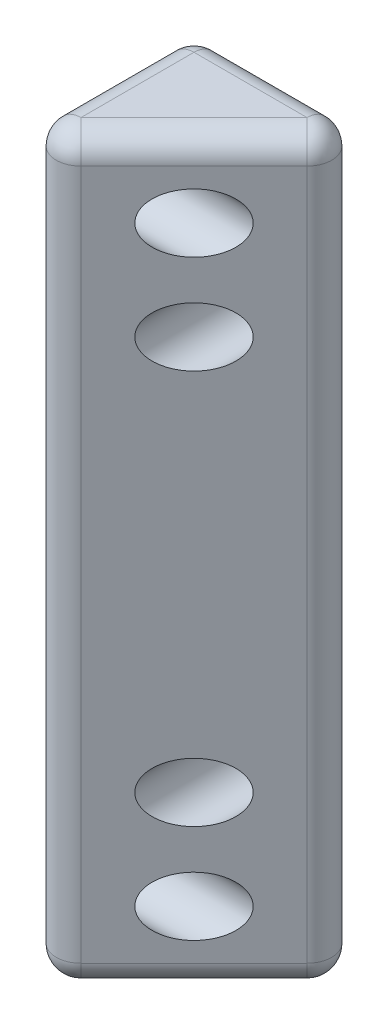
ISO-10303-21;
HEADER;
FILE_DESCRIPTION(('STEP AP214'),'2;1');
FILE_NAME('part.step','',(''),(''),'','','');
FILE_SCHEMA(('AUTOMOTIVE_DESIGN { 1 0 10303 214 1 1 1 1 }'));
ENDSEC;
DATA;
#1=APPLICATION_CONTEXT('core data for automotive mechanical design processes');
#2=APPLICATION_PROTOCOL_DEFINITION('international standard','automotive_design',2000,#1);
#3=PRODUCT_CONTEXT('',#1,'mechanical');
#4=PRODUCT('Part','Part','',(#3));
#5=PRODUCT_RELATED_PRODUCT_CATEGORY('part','',(#4));
#6=PRODUCT_DEFINITION_FORMATION('','',#4);
#7=PRODUCT_DEFINITION_CONTEXT('part definition',#1,'design');
#8=PRODUCT_DEFINITION('design','',#6,#7);
#9=PRODUCT_DEFINITION_SHAPE('','',#8);
#10=(LENGTH_UNIT() NAMED_UNIT(*) SI_UNIT(.MILLI.,.METRE.));
#11=(NAMED_UNIT(*) PLANE_ANGLE_UNIT() SI_UNIT($,.RADIAN.));
#12=(NAMED_UNIT(*) SI_UNIT($,.STERADIAN.) SOLID_ANGLE_UNIT());
#13=UNCERTAINTY_MEASURE_WITH_UNIT(LENGTH_MEASURE(1.E-05),#10,'distance_accuracy_value','');
#14=(GEOMETRIC_REPRESENTATION_CONTEXT(3) GLOBAL_UNCERTAINTY_ASSIGNED_CONTEXT((#13)) GLOBAL_UNIT_ASSIGNED_CONTEXT((#10,
#11,#12)) REPRESENTATION_CONTEXT('',''));
#15=CARTESIAN_POINT('',(0.,0.,0.));
#16=DIRECTION('',(0.,0.,1.));
#17=DIRECTION('',(1.,0.,0.));
#18=AXIS2_PLACEMENT_3D('',#15,#16,#17);
#19=CARTESIAN_POINT('',(-12.7,23.8125,12.7));
#20=DIRECTION('',(-0.707106781186548,0.,-0.707106781186547));
#21=DIRECTION('',(-0.707106781186547,0.,0.707106781186548));
#22=AXIS2_PLACEMENT_3D('',#19,#20,#21);
#23=PLANE('',#22);
#24=DIRECTION('',(0.707106781186547,0.,-0.707106781186548));
#25=VECTOR('',#24,1.);
#26=CARTESIAN_POINT('',(-12.7,-22.225,12.7));
#27=LINE('',#26,#25);
#28=CARTESIAN_POINT('',(-9.98996798486635,-22.225,9.98996798486636));
#29=VERTEX_POINT('',#28);
#30=CARTESIAN_POINT('',(-2.71003201513364,-22.225,2.71003201513364));
#31=VERTEX_POINT('',#30);
#32=EDGE_CURVE('E192',#29,#31,#27,.T.);
#33=ORIENTED_EDGE('',*,*,#32,.T.);
#34=DIRECTION('',(0.,-1.,0.));
#35=VECTOR('',#34,1.);
#36=CARTESIAN_POINT('',(-2.71003201513364,23.8125,2.71003201513364));
#37=LINE('',#36,#35);
#38=CARTESIAN_POINT('',(-2.71003201513364,22.225,2.71003201513364));
#39=VERTEX_POINT('',#38);
#40=EDGE_CURVE('E196',#31,#39,#37,.F.);
#41=ORIENTED_EDGE('',*,*,#40,.T.);
#42=DIRECTION('',(0.707106781186547,0.,-0.707106781186548));
#43=VECTOR('',#42,1.);
#44=CARTESIAN_POINT('',(-12.7,22.225,12.7));
#45=LINE('',#44,#43);
#46=CARTESIAN_POINT('',(-9.98996798486635,22.225,9.98996798486636));
#47=VERTEX_POINT('',#46);
#48=EDGE_CURVE('E189',#39,#47,#45,.F.);
#49=ORIENTED_EDGE('',*,*,#48,.T.);
#50=DIRECTION('',(0.,-1.,0.));
#51=VECTOR('',#50,1.);
#52=CARTESIAN_POINT('',(-9.98996798486635,23.8125,9.98996798486636));
#53=LINE('',#52,#51);
#54=EDGE_CURVE('E186',#47,#29,#53,.T.);
#55=ORIENTED_EDGE('',*,*,#54,.T.);
#56=EDGE_LOOP('',(#33,#41,#49,#55));
#57=FACE_BOUND('',#56,.T.);
#58=CARTESIAN_POINT('',(-6.35,-12.7,6.35000000000001));
#59=DIRECTION('',(-0.707106781186548,0.,-0.707106781186547));
#60=DIRECTION('',(0.707106781186547,0.,-0.707106781186548));
#61=AXIS2_PLACEMENT_3D('',#58,#59,#60);
#62=ELLIPSE('',#61,2.69407683632075,1.905);
#63=CARTESIAN_POINT('',(-4.445,-12.7,4.44500000000001));
#64=VERTEX_POINT('',#63);
#65=EDGE_CURVE('E276',#64,#64,#62,.T.);
#66=ORIENTED_EDGE('',*,*,#65,.T.);
#67=EDGE_LOOP('',(#66));
#68=FACE_BOUND('',#67,.T.);
#69=CARTESIAN_POINT('',(-6.35,12.7,6.35000000000001));
#70=DIRECTION('',(-0.707106781186548,0.,-0.707106781186547));
#71=DIRECTION('',(0.707106781186547,0.,-0.707106781186548));
#72=AXIS2_PLACEMENT_3D('',#69,#70,#71);
#73=ELLIPSE('',#72,2.69407683632075,1.905);
#74=CARTESIAN_POINT('',(-4.445,12.7,4.44500000000001));
#75=VERTEX_POINT('',#74);
#76=EDGE_CURVE('E270',#75,#75,#73,.T.);
#77=ORIENTED_EDGE('',*,*,#76,.T.);
#78=EDGE_LOOP('',(#77));
#79=FACE_BOUND('',#78,.T.);
#80=CARTESIAN_POINT('',(-6.35,19.05,6.35));
#81=DIRECTION('',(-0.707106781186548,0.,-0.707106781186547));
#82=DIRECTION('',(-0.707106781186547,0.,0.707106781186548));
#83=AXIS2_PLACEMENT_3D('',#80,#81,#82);
#84=ELLIPSE('',#83,2.69407683632075,1.905);
#85=CARTESIAN_POINT('',(-8.255,19.05,8.255));
#86=VERTEX_POINT('',#85);
#87=EDGE_CURVE('E151',#86,#86,#84,.T.);
#88=ORIENTED_EDGE('',*,*,#87,.T.);
#89=EDGE_LOOP('',(#88));
#90=FACE_BOUND('',#89,.T.);
#91=CARTESIAN_POINT('',(-6.35,-19.05,6.35));
#92=DIRECTION('',(-0.707106781186548,0.,-0.707106781186547));
#93=DIRECTION('',(-0.707106781186547,0.,0.707106781186548));
#94=AXIS2_PLACEMENT_3D('',#91,#92,#93);
#95=ELLIPSE('',#94,2.69407683632075,1.905);
#96=CARTESIAN_POINT('',(-8.255,-19.05,8.255));
#97=VERTEX_POINT('',#96);
#98=EDGE_CURVE('E285',#97,#97,#95,.T.);
#99=ORIENTED_EDGE('',*,*,#98,.T.);
#100=EDGE_LOOP('',(#99));
#101=FACE_BOUND('',#100,.T.);
#102=ADVANCED_FACE('F48',(#57,#68,#79,#90,#101),#23,.F.);
#103=CARTESIAN_POINT('',(0.,23.8125,0.));
#104=DIRECTION('',(0.,0.,1.));
#105=DIRECTION('',(1.,0.,0.));
#106=AXIS2_PLACEMENT_3D('',#103,#104,#105);
#107=PLANE('',#106);
#108=DIRECTION('',(-1.,0.,0.));
#109=VECTOR('',#108,1.);
#110=CARTESIAN_POINT('',(0.,22.225,0.));
#111=LINE('',#110,#109);
#112=CARTESIAN_POINT('',(-11.1125,22.225,0.));
#113=VERTEX_POINT('',#112);
#114=CARTESIAN_POINT('',(-3.83256403026729,22.225,0.));
#115=VERTEX_POINT('',#114);
#116=EDGE_CURVE('E150',#113,#115,#111,.F.);
#117=ORIENTED_EDGE('',*,*,#116,.T.);
#118=DIRECTION('',(0.,-1.,0.));
#119=VECTOR('',#118,1.);
#120=CARTESIAN_POINT('',(-3.83256403026729,23.8125,0.));
#121=LINE('',#120,#119);
#122=CARTESIAN_POINT('',(-3.83256403026729,-22.225,0.));
#123=VERTEX_POINT('',#122);
#124=EDGE_CURVE('E156',#115,#123,#121,.T.);
#125=ORIENTED_EDGE('',*,*,#124,.T.);
#126=DIRECTION('',(-1.,0.,0.));
#127=VECTOR('',#126,1.);
#128=CARTESIAN_POINT('',(0.,-22.225,0.));
#129=LINE('',#128,#127);
#130=CARTESIAN_POINT('',(-11.1125,-22.225,0.));
#131=VERTEX_POINT('',#130);
#132=EDGE_CURVE('E123',#123,#131,#129,.T.);
#133=ORIENTED_EDGE('',*,*,#132,.T.);
#134=DIRECTION('',(0.,-1.,0.));
#135=VECTOR('',#134,1.);
#136=CARTESIAN_POINT('',(-11.1125,23.8125,0.));
#137=LINE('',#136,#135);
#138=EDGE_CURVE('E143',#131,#113,#137,.F.);
#139=ORIENTED_EDGE('',*,*,#138,.T.);
#140=EDGE_LOOP('',(#117,#125,#133,#139));
#141=FACE_BOUND('',#140,.T.);
#142=CARTESIAN_POINT('',(-6.35,-12.7,0.));
#143=DIRECTION('',(0.,0.,-1.));
#144=DIRECTION('',(-1.,0.,0.));
#145=AXIS2_PLACEMENT_3D('',#142,#143,#144);
#146=CIRCLE('',#145,1.905);
#147=CARTESIAN_POINT('',(-8.25500000000001,-12.7,0.));
#148=VERTEX_POINT('',#147);
#149=EDGE_CURVE('E264',#148,#148,#146,.T.);
#150=ORIENTED_EDGE('',*,*,#149,.F.);
#151=EDGE_LOOP('',(#150));
#152=FACE_BOUND('',#151,.T.);
#153=CARTESIAN_POINT('',(-6.35,12.7,0.));
#154=DIRECTION('',(0.,0.,-1.));
#155=DIRECTION('',(-1.,0.,0.));
#156=AXIS2_PLACEMENT_3D('',#153,#154,#155);
#157=CIRCLE('',#156,1.905);
#158=CARTESIAN_POINT('',(-8.25500000000001,12.7,0.));
#159=VERTEX_POINT('',#158);
#160=EDGE_CURVE('E257',#159,#159,#157,.T.);
#161=ORIENTED_EDGE('',*,*,#160,.F.);
#162=EDGE_LOOP('',(#161));
#163=FACE_BOUND('',#162,.T.);
#164=ADVANCED_FACE('F153',(#141,#152,#163),#107,.F.);
#165=CARTESIAN_POINT('',(-12.7,23.8125,0.));
#166=DIRECTION('',(1.,0.,0.));
#167=DIRECTION('',(0.,0.,-1.));
#168=AXIS2_PLACEMENT_3D('',#165,#166,#167);
#169=PLANE('',#168);
#170=DIRECTION('',(0.,0.,1.));
#171=VECTOR('',#170,1.);
#172=CARTESIAN_POINT('',(-12.7,22.225,0.));
#173=LINE('',#172,#171);
#174=CARTESIAN_POINT('',(-12.7,22.225,8.86743596973271));
#175=VERTEX_POINT('',#174);
#176=CARTESIAN_POINT('',(-12.7,22.225,1.5875));
#177=VERTEX_POINT('',#176);
#178=EDGE_CURVE('E176',#175,#177,#173,.F.);
#179=ORIENTED_EDGE('',*,*,#178,.T.);
#180=DIRECTION('',(0.,-1.,0.));
#181=VECTOR('',#180,1.);
#182=CARTESIAN_POINT('',(-12.7,23.8125,1.5875));
#183=LINE('',#182,#181);
#184=CARTESIAN_POINT('',(-12.7,-22.225,1.5875));
#185=VERTEX_POINT('',#184);
#186=EDGE_CURVE('E183',#177,#185,#183,.T.);
#187=ORIENTED_EDGE('',*,*,#186,.T.);
#188=DIRECTION('',(0.,0.,1.));
#189=VECTOR('',#188,1.);
#190=CARTESIAN_POINT('',(-12.7,-22.225,0.));
#191=LINE('',#190,#189);
#192=CARTESIAN_POINT('',(-12.7,-22.225,8.86743596973271));
#193=VERTEX_POINT('',#192);
#194=EDGE_CURVE('E179',#185,#193,#191,.T.);
#195=ORIENTED_EDGE('',*,*,#194,.T.);
#196=DIRECTION('',(0.,-1.,0.));
#197=VECTOR('',#196,1.);
#198=CARTESIAN_POINT('',(-12.7,23.8125,8.86743596973271));
#199=LINE('',#198,#197);
#200=EDGE_CURVE('E173',#193,#175,#199,.F.);
#201=ORIENTED_EDGE('',*,*,#200,.T.);
#202=EDGE_LOOP('',(#179,#187,#195,#201));
#203=FACE_BOUND('',#202,.T.);
#204=CARTESIAN_POINT('',(-12.7,19.05,6.35));
#205=DIRECTION('',(-1.,0.,0.));
#206=DIRECTION('',(0.,0.,1.));
#207=AXIS2_PLACEMENT_3D('',#204,#205,#206);
#208=CIRCLE('',#207,1.905);
#209=CARTESIAN_POINT('',(-12.7,19.05,8.255));
#210=VERTEX_POINT('',#209);
#211=EDGE_CURVE('E281',#210,#210,#208,.T.);
#212=ORIENTED_EDGE('',*,*,#211,.F.);
#213=EDGE_LOOP('',(#212));
#214=FACE_BOUND('',#213,.T.);
#215=CARTESIAN_POINT('',(-12.7,-19.05,6.35));
#216=DIRECTION('',(-1.,0.,0.));
#217=DIRECTION('',(0.,0.,1.));
#218=AXIS2_PLACEMENT_3D('',#215,#216,#217);
#219=CIRCLE('',#218,1.905);
#220=CARTESIAN_POINT('',(-12.7,-19.05,8.255));
#221=VERTEX_POINT('',#220);
#222=EDGE_CURVE('E280',#221,#221,#219,.T.);
#223=ORIENTED_EDGE('',*,*,#222,.F.);
#224=EDGE_LOOP('',(#223));
#225=FACE_BOUND('',#224,.T.);
#226=ADVANCED_FACE('F320',(#203,#214,#225),#169,.F.);
#227=CARTESIAN_POINT('',(0.,23.8125,0.));
#228=DIRECTION('',(0.,1.,0.));
#229=DIRECTION('',(0.,0.,1.));
#230=AXIS2_PLACEMENT_3D('',#227,#228,#229);
#231=PLANE('',#230);
#232=DIRECTION('',(-1.,0.,0.));
#233=VECTOR('',#232,1.);
#234=CARTESIAN_POINT('',(-12.7,23.8125,1.5875));
#235=LINE('',#234,#233);
#236=CARTESIAN_POINT('',(-3.83256403026729,23.8125,1.5875));
#237=VERTEX_POINT('',#236);
#238=CARTESIAN_POINT('',(-11.1125,23.8125,1.5875));
#239=VERTEX_POINT('',#238);
#240=EDGE_CURVE('E58',#237,#239,#235,.T.);
#241=ORIENTED_EDGE('',*,*,#240,.T.);
#242=DIRECTION('',(0.,0.,1.));
#243=VECTOR('',#242,1.);
#244=CARTESIAN_POINT('',(-11.1125,23.8125,12.7));
#245=LINE('',#244,#243);
#246=CARTESIAN_POINT('',(-11.1125,23.8125,8.86743596973271));
#247=VERTEX_POINT('',#246);
#248=EDGE_CURVE('E11',#239,#247,#245,.T.);
#249=ORIENTED_EDGE('',*,*,#248,.T.);
#250=DIRECTION('',(0.707106781186547,0.,-0.707106781186548));
#251=VECTOR('',#250,1.);
#252=CARTESIAN_POINT('',(-1.12253201513364,23.8125,-1.12253201513364));
#253=LINE('',#252,#251);
#254=EDGE_CURVE('E68',#247,#237,#253,.T.);
#255=ORIENTED_EDGE('',*,*,#254,.T.);
#256=EDGE_LOOP('',(#241,#249,#255));
#257=FACE_BOUND('',#256,.T.);
#258=ADVANCED_FACE('F400',(#257),#231,.T.);
#259=CARTESIAN_POINT('',(0.,-23.8125,0.));
#260=DIRECTION('',(0.,1.,0.));
#261=DIRECTION('',(0.,0.,1.));
#262=AXIS2_PLACEMENT_3D('',#259,#260,#261);
#263=PLANE('',#262);
#264=DIRECTION('',(0.,0.,1.));
#265=VECTOR('',#264,1.);
#266=CARTESIAN_POINT('',(-11.1125,-23.8125,0.));
#267=LINE('',#266,#265);
#268=CARTESIAN_POINT('',(-11.1125,-23.8125,8.86743596973271));
#269=VERTEX_POINT('',#268);
#270=CARTESIAN_POINT('',(-11.1125,-23.8125,1.5875));
#271=VERTEX_POINT('',#270);
#272=EDGE_CURVE('E168',#269,#271,#267,.F.);
#273=ORIENTED_EDGE('',*,*,#272,.T.);
#274=DIRECTION('',(-1.,0.,0.));
#275=VECTOR('',#274,1.);
#276=CARTESIAN_POINT('',(0.,-23.8125,1.5875));
#277=LINE('',#276,#275);
#278=CARTESIAN_POINT('',(-3.83256403026729,-23.8125,1.5875));
#279=VERTEX_POINT('',#278);
#280=EDGE_CURVE('E125',#271,#279,#277,.F.);
#281=ORIENTED_EDGE('',*,*,#280,.T.);
#282=DIRECTION('',(0.707106781186547,0.,-0.707106781186548));
#283=VECTOR('',#282,1.);
#284=CARTESIAN_POINT('',(-1.12253201513364,-23.8125,-1.12253201513364));
#285=LINE('',#284,#283);
#286=EDGE_CURVE('E162',#279,#269,#285,.F.);
#287=ORIENTED_EDGE('',*,*,#286,.T.);
#288=EDGE_LOOP('',(#273,#281,#287));
#289=FACE_BOUND('',#288,.T.);
#290=ADVANCED_FACE('F310',(#289),#263,.F.);
#291=CARTESIAN_POINT('',(0.,-19.05,6.35));
#292=DIRECTION('',(-1.,0.,0.));
#293=DIRECTION('',(0.,0.,1.));
#294=AXIS2_PLACEMENT_3D('',#291,#292,#293);
#295=CYLINDRICAL_SURFACE('',#294,1.905);
#296=ORIENTED_EDGE('',*,*,#222,.T.);
#297=EDGE_LOOP('',(#296));
#298=FACE_BOUND('',#297,.T.);
#299=ORIENTED_EDGE('',*,*,#98,.F.);
#300=EDGE_LOOP('',(#299));
#301=FACE_BOUND('',#300,.T.);
#302=ADVANCED_FACE('F301',(#298,#301),#295,.F.);
#303=CARTESIAN_POINT('',(0.,19.05,6.35));
#304=DIRECTION('',(-1.,0.,0.));
#305=DIRECTION('',(0.,0.,1.));
#306=AXIS2_PLACEMENT_3D('',#303,#304,#305);
#307=CYLINDRICAL_SURFACE('',#306,1.905);
#308=ORIENTED_EDGE('',*,*,#211,.T.);
#309=EDGE_LOOP('',(#308));
#310=FACE_BOUND('',#309,.T.);
#311=ORIENTED_EDGE('',*,*,#87,.F.);
#312=EDGE_LOOP('',(#311));
#313=FACE_BOUND('',#312,.T.);
#314=ADVANCED_FACE('F298',(#310,#313),#307,.F.);
#315=CARTESIAN_POINT('',(-6.35,12.7,12.7));
#316=DIRECTION('',(0.,0.,-1.));
#317=DIRECTION('',(-1.,0.,0.));
#318=AXIS2_PLACEMENT_3D('',#315,#316,#317);
#319=CYLINDRICAL_SURFACE('',#318,1.905);
#320=ORIENTED_EDGE('',*,*,#160,.T.);
#321=EDGE_LOOP('',(#320));
#322=FACE_BOUND('',#321,.T.);
#323=ORIENTED_EDGE('',*,*,#76,.F.);
#324=EDGE_LOOP('',(#323));
#325=FACE_BOUND('',#324,.T.);
#326=ADVANCED_FACE('F300',(#322,#325),#319,.F.);
#327=CARTESIAN_POINT('',(-6.35,-12.7,12.7));
#328=DIRECTION('',(0.,0.,-1.));
#329=DIRECTION('',(-1.,0.,0.));
#330=AXIS2_PLACEMENT_3D('',#327,#328,#329);
#331=CYLINDRICAL_SURFACE('',#330,1.905);
#332=ORIENTED_EDGE('',*,*,#149,.T.);
#333=EDGE_LOOP('',(#332));
#334=FACE_BOUND('',#333,.T.);
#335=ORIENTED_EDGE('',*,*,#65,.F.);
#336=EDGE_LOOP('',(#335));
#337=FACE_BOUND('',#336,.T.);
#338=ADVANCED_FACE('F308',(#334,#337),#331,.F.);
#339=CARTESIAN_POINT('',(-11.1125,22.225,8.86743596973271));
#340=DIRECTION('',(0.,1.,0.));
#341=DIRECTION('',(0.,0.,1.));
#342=AXIS2_PLACEMENT_3D('',#339,#340,#341);
#343=SPHERICAL_SURFACE('',#342,1.5875);
#344=CARTESIAN_POINT('',(-11.1125,22.225,8.86743596973271));
#345=DIRECTION('',(0.,1.,0.));
#346=DIRECTION('',(0.,0.,1.));
#347=AXIS2_PLACEMENT_3D('',#344,#345,#346);
#348=CIRCLE('',#347,1.5875);
#349=EDGE_CURVE('E246',#47,#175,#348,.F.);
#350=ORIENTED_EDGE('',*,*,#349,.F.);
#351=CARTESIAN_POINT('',(-11.1125,22.225,8.86743596973271));
#352=DIRECTION('',(-0.707106781186547,0.,0.707106781186548));
#353=DIRECTION('',(0.707106781186548,0.,0.707106781186547));
#354=AXIS2_PLACEMENT_3D('',#351,#352,#353);
#355=CIRCLE('',#354,1.5875);
#356=EDGE_CURVE('E52',#247,#47,#355,.F.);
#357=ORIENTED_EDGE('',*,*,#356,.F.);
#358=CARTESIAN_POINT('',(-11.1125,22.225,8.86743596973271));
#359=DIRECTION('',(0.,0.,1.));
#360=DIRECTION('',(1.,0.,0.));
#361=AXIS2_PLACEMENT_3D('',#358,#359,#360);
#362=CIRCLE('',#361,1.5875);
#363=EDGE_CURVE('E249',#175,#247,#362,.F.);
#364=ORIENTED_EDGE('',*,*,#363,.F.);
#365=EDGE_LOOP('',(#350,#357,#364));
#366=FACE_BOUND('',#365,.T.);
#367=ADVANCED_FACE('F50',(#366),#343,.T.);
#368=CARTESIAN_POINT('',(-1.12253201513364,22.225,-1.12253201513364));
#369=DIRECTION('',(-0.707106781186547,0.,0.707106781186548));
#370=DIRECTION('',(0.707106781186548,0.,0.707106781186547));
#371=AXIS2_PLACEMENT_3D('',#368,#369,#370);
#372=CYLINDRICAL_SURFACE('',#371,1.5875);
#373=ORIENTED_EDGE('',*,*,#356,.T.);
#374=ORIENTED_EDGE('',*,*,#48,.F.);
#375=CARTESIAN_POINT('',(-3.83256403026729,22.225,1.5875));
#376=DIRECTION('',(0.707106781186547,0.,-0.707106781186548));
#377=DIRECTION('',(-0.707106781186548,0.,-0.707106781186547));
#378=AXIS2_PLACEMENT_3D('',#375,#376,#377);
#379=CIRCLE('',#378,1.5875);
#380=EDGE_CURVE('E242',#237,#39,#379,.T.);
#381=ORIENTED_EDGE('',*,*,#380,.F.);
#382=ORIENTED_EDGE('',*,*,#254,.F.);
#383=EDGE_LOOP('',(#373,#374,#381,#382));
#384=FACE_BOUND('',#383,.T.);
#385=ADVANCED_FACE('F368',(#384),#372,.T.);
#386=CARTESIAN_POINT('',(0.,22.225,1.5875));
#387=DIRECTION('',(1.,0.,0.));
#388=DIRECTION('',(0.,0.,-1.));
#389=AXIS2_PLACEMENT_3D('',#386,#387,#388);
#390=CYLINDRICAL_SURFACE('',#389,1.5875);
#391=CARTESIAN_POINT('',(-11.1125,22.225,1.5875));
#392=DIRECTION('',(-1.,0.,0.));
#393=DIRECTION('',(0.,0.,1.));
#394=AXIS2_PLACEMENT_3D('',#391,#392,#393);
#395=CIRCLE('',#394,1.5875);
#396=EDGE_CURVE('E234',#239,#113,#395,.T.);
#397=ORIENTED_EDGE('',*,*,#396,.F.);
#398=ORIENTED_EDGE('',*,*,#240,.F.);
#399=CARTESIAN_POINT('',(-3.83256403026729,22.225,1.5875));
#400=DIRECTION('',(1.,0.,0.));
#401=DIRECTION('',(0.,0.,-1.));
#402=AXIS2_PLACEMENT_3D('',#399,#400,#401);
#403=CIRCLE('',#402,1.5875);
#404=EDGE_CURVE('E238',#115,#237,#403,.T.);
#405=ORIENTED_EDGE('',*,*,#404,.F.);
#406=ORIENTED_EDGE('',*,*,#116,.F.);
#407=EDGE_LOOP('',(#397,#398,#405,#406));
#408=FACE_BOUND('',#407,.T.);
#409=ADVANCED_FACE('F366',(#408),#390,.T.);
#410=CARTESIAN_POINT('',(-11.1125,22.225,0.));
#411=DIRECTION('',(0.,0.,-1.));
#412=DIRECTION('',(-1.,0.,0.));
#413=AXIS2_PLACEMENT_3D('',#410,#411,#412);
#414=CYLINDRICAL_SURFACE('',#413,1.5875);
#415=ORIENTED_EDGE('',*,*,#363,.T.);
#416=ORIENTED_EDGE('',*,*,#248,.F.);
#417=CARTESIAN_POINT('',(-11.1125,22.225,1.5875));
#418=DIRECTION('',(0.,0.,-1.));
#419=DIRECTION('',(-1.,0.,0.));
#420=AXIS2_PLACEMENT_3D('',#417,#418,#419);
#421=CIRCLE('',#420,1.5875);
#422=EDGE_CURVE('E230',#177,#239,#421,.T.);
#423=ORIENTED_EDGE('',*,*,#422,.F.);
#424=ORIENTED_EDGE('',*,*,#178,.F.);
#425=EDGE_LOOP('',(#415,#416,#423,#424));
#426=FACE_BOUND('',#425,.T.);
#427=ADVANCED_FACE('F362',(#426),#414,.T.);
#428=CARTESIAN_POINT('',(-11.1125,23.8125,8.86743596973271));
#429=DIRECTION('',(0.,-1.,0.));
#430=DIRECTION('',(0.,0.,-1.));
#431=AXIS2_PLACEMENT_3D('',#428,#429,#430);
#432=CYLINDRICAL_SURFACE('',#431,1.5875);
#433=ORIENTED_EDGE('',*,*,#349,.T.);
#434=ORIENTED_EDGE('',*,*,#200,.F.);
#435=CARTESIAN_POINT('',(-11.1125,-22.225,8.86743596973271));
#436=DIRECTION('',(0.,-1.,0.));
#437=DIRECTION('',(0.,0.,-1.));
#438=AXIS2_PLACEMENT_3D('',#435,#436,#437);
#439=CIRCLE('',#438,1.5875);
#440=EDGE_CURVE('E226',#29,#193,#439,.T.);
#441=ORIENTED_EDGE('',*,*,#440,.F.);
#442=ORIENTED_EDGE('',*,*,#54,.F.);
#443=EDGE_LOOP('',(#433,#434,#441,#442));
#444=FACE_BOUND('',#443,.T.);
#445=ADVANCED_FACE('F358',(#444),#432,.T.);
#446=CARTESIAN_POINT('',(-3.83256403026729,22.225,1.5875));
#447=DIRECTION('',(0.,1.,0.));
#448=DIRECTION('',(-1.,0.,0.));
#449=AXIS2_PLACEMENT_3D('',#446,#447,#448);
#450=SPHERICAL_SURFACE('',#449,1.5875);
#451=ORIENTED_EDGE('',*,*,#404,.T.);
#452=ORIENTED_EDGE('',*,*,#380,.T.);
#453=CARTESIAN_POINT('',(-3.83256403026729,22.225,1.5875));
#454=DIRECTION('',(0.,1.,0.));
#455=DIRECTION('',(0.,0.,1.));
#456=AXIS2_PLACEMENT_3D('',#453,#454,#455);
#457=CIRCLE('',#456,1.5875);
#458=EDGE_CURVE('E218',#115,#39,#457,.F.);
#459=ORIENTED_EDGE('',*,*,#458,.F.);
#460=EDGE_LOOP('',(#451,#452,#459));
#461=FACE_BOUND('',#460,.T.);
#462=ADVANCED_FACE('F354',(#461),#450,.T.);
#463=CARTESIAN_POINT('',(-11.1125,22.225,1.5875));
#464=DIRECTION('',(0.,1.,0.));
#465=DIRECTION('',(0.,0.,1.));
#466=AXIS2_PLACEMENT_3D('',#463,#464,#465);
#467=SPHERICAL_SURFACE('',#466,1.5875);
#468=ORIENTED_EDGE('',*,*,#422,.T.);
#469=ORIENTED_EDGE('',*,*,#396,.T.);
#470=CARTESIAN_POINT('',(-11.1125,22.225,1.5875));
#471=DIRECTION('',(0.,1.,0.));
#472=DIRECTION('',(0.,0.,1.));
#473=AXIS2_PLACEMENT_3D('',#470,#471,#472);
#474=CIRCLE('',#473,1.5875);
#475=EDGE_CURVE('E146',#177,#113,#474,.F.);
#476=ORIENTED_EDGE('',*,*,#475,.F.);
#477=EDGE_LOOP('',(#468,#469,#476));
#478=FACE_BOUND('',#477,.T.);
#479=ADVANCED_FACE('F350',(#478),#467,.T.);
#480=CARTESIAN_POINT('',(-11.1125,-22.225,8.86743596973271));
#481=DIRECTION('',(0.,-1.,0.));
#482=DIRECTION('',(0.,0.,-1.));
#483=AXIS2_PLACEMENT_3D('',#480,#481,#482);
#484=SPHERICAL_SURFACE('',#483,1.5875);
#485=CARTESIAN_POINT('',(-11.1125,-22.225,8.86743596973271));
#486=DIRECTION('',(0.,0.,1.));
#487=DIRECTION('',(0.,-1.,0.));
#488=AXIS2_PLACEMENT_3D('',#485,#486,#487);
#489=CIRCLE('',#488,1.5875);
#490=EDGE_CURVE('E213',#269,#193,#489,.F.);
#491=ORIENTED_EDGE('',*,*,#490,.F.);
#492=CARTESIAN_POINT('',(-11.1125,-22.225,8.86743596973271));
#493=DIRECTION('',(-0.707106781186547,0.,0.707106781186548));
#494=DIRECTION('',(0.707106781186548,0.,0.707106781186547));
#495=AXIS2_PLACEMENT_3D('',#492,#493,#494);
#496=CIRCLE('',#495,1.5875);
#497=EDGE_CURVE('E222',#29,#269,#496,.F.);
#498=ORIENTED_EDGE('',*,*,#497,.F.);
#499=ORIENTED_EDGE('',*,*,#440,.T.);
#500=EDGE_LOOP('',(#491,#498,#499));
#501=FACE_BOUND('',#500,.T.);
#502=ADVANCED_FACE('F346',(#501),#484,.T.);
#503=CARTESIAN_POINT('',(-13.8225320151336,-22.225,11.5774679848664));
#504=DIRECTION('',(0.707106781186547,0.,-0.707106781186548));
#505=DIRECTION('',(-0.707106781186548,0.,-0.707106781186547));
#506=AXIS2_PLACEMENT_3D('',#503,#504,#505);
#507=CYLINDRICAL_SURFACE('',#506,1.5875);
#508=ORIENTED_EDGE('',*,*,#497,.T.);
#509=ORIENTED_EDGE('',*,*,#286,.F.);
#510=CARTESIAN_POINT('',(-3.83256403026729,-22.225,1.5875));
#511=DIRECTION('',(0.707106781186547,0.,-0.707106781186548));
#512=DIRECTION('',(-0.707106781186548,0.,-0.707106781186547));
#513=AXIS2_PLACEMENT_3D('',#510,#511,#512);
#514=CIRCLE('',#513,1.5875);
#515=EDGE_CURVE('E209',#31,#279,#514,.T.);
#516=ORIENTED_EDGE('',*,*,#515,.F.);
#517=ORIENTED_EDGE('',*,*,#32,.F.);
#518=EDGE_LOOP('',(#508,#509,#516,#517));
#519=FACE_BOUND('',#518,.T.);
#520=ADVANCED_FACE('F342',(#519),#507,.T.);
#521=CARTESIAN_POINT('',(-3.83256403026729,23.8125,1.5875));
#522=DIRECTION('',(0.,-1.,0.));
#523=DIRECTION('',(0.,0.,-1.));
#524=AXIS2_PLACEMENT_3D('',#521,#522,#523);
#525=CYLINDRICAL_SURFACE('',#524,1.5875);
#526=ORIENTED_EDGE('',*,*,#458,.T.);
#527=ORIENTED_EDGE('',*,*,#40,.F.);
#528=CARTESIAN_POINT('',(-3.83256403026729,-22.225,1.5875));
#529=DIRECTION('',(0.,-1.,0.));
#530=DIRECTION('',(0.,0.,-1.));
#531=AXIS2_PLACEMENT_3D('',#528,#529,#530);
#532=CIRCLE('',#531,1.5875);
#533=EDGE_CURVE('E140',#123,#31,#532,.T.);
#534=ORIENTED_EDGE('',*,*,#533,.F.);
#535=ORIENTED_EDGE('',*,*,#124,.F.);
#536=EDGE_LOOP('',(#526,#527,#534,#535));
#537=FACE_BOUND('',#536,.T.);
#538=ADVANCED_FACE('F339',(#537),#525,.T.);
#539=CARTESIAN_POINT('',(-11.1125,23.8125,1.5875));
#540=DIRECTION('',(0.,-1.,0.));
#541=DIRECTION('',(0.,0.,-1.));
#542=AXIS2_PLACEMENT_3D('',#539,#540,#541);
#543=CYLINDRICAL_SURFACE('',#542,1.5875);
#544=ORIENTED_EDGE('',*,*,#475,.T.);
#545=ORIENTED_EDGE('',*,*,#138,.F.);
#546=CARTESIAN_POINT('',(-11.1125,-22.225,1.5875));
#547=DIRECTION('',(0.,-1.,0.));
#548=DIRECTION('',(0.,0.,-1.));
#549=AXIS2_PLACEMENT_3D('',#546,#547,#548);
#550=CIRCLE('',#549,1.5875);
#551=EDGE_CURVE('E132',#185,#131,#550,.T.);
#552=ORIENTED_EDGE('',*,*,#551,.F.);
#553=ORIENTED_EDGE('',*,*,#186,.F.);
#554=EDGE_LOOP('',(#544,#545,#552,#553));
#555=FACE_BOUND('',#554,.T.);
#556=ADVANCED_FACE('F144',(#555),#543,.T.);
#557=CARTESIAN_POINT('',(-11.1125,-22.225,0.));
#558=DIRECTION('',(0.,0.,1.));
#559=DIRECTION('',(1.,0.,0.));
#560=AXIS2_PLACEMENT_3D('',#557,#558,#559);
#561=CYLINDRICAL_SURFACE('',#560,1.5875);
#562=ORIENTED_EDGE('',*,*,#490,.T.);
#563=ORIENTED_EDGE('',*,*,#194,.F.);
#564=CARTESIAN_POINT('',(-11.1125,-22.225,1.5875));
#565=DIRECTION('',(0.,0.,-1.));
#566=DIRECTION('',(-1.,0.,0.));
#567=AXIS2_PLACEMENT_3D('',#564,#565,#566);
#568=CIRCLE('',#567,1.5875);
#569=EDGE_CURVE('E136',#271,#185,#568,.T.);
#570=ORIENTED_EDGE('',*,*,#569,.F.);
#571=ORIENTED_EDGE('',*,*,#272,.F.);
#572=EDGE_LOOP('',(#562,#563,#570,#571));
#573=FACE_BOUND('',#572,.T.);
#574=ADVANCED_FACE('F332',(#573),#561,.T.);
#575=CARTESIAN_POINT('',(-3.83256403026729,-22.225,1.5875));
#576=DIRECTION('',(0.,-1.,0.));
#577=DIRECTION('',(1.,0.,0.));
#578=AXIS2_PLACEMENT_3D('',#575,#576,#577);
#579=SPHERICAL_SURFACE('',#578,1.5875);
#580=ORIENTED_EDGE('',*,*,#533,.T.);
#581=ORIENTED_EDGE('',*,*,#515,.T.);
#582=CARTESIAN_POINT('',(-3.83256403026729,-22.225,1.5875));
#583=DIRECTION('',(1.,0.,0.));
#584=DIRECTION('',(0.,0.,-1.));
#585=AXIS2_PLACEMENT_3D('',#582,#583,#584);
#586=CIRCLE('',#585,1.5875);
#587=EDGE_CURVE('E129',#123,#279,#586,.F.);
#588=ORIENTED_EDGE('',*,*,#587,.F.);
#589=EDGE_LOOP('',(#580,#581,#588));
#590=FACE_BOUND('',#589,.T.);
#591=ADVANCED_FACE('F329',(#590),#579,.T.);
#592=CARTESIAN_POINT('',(-11.1125,-22.225,1.5875));
#593=DIRECTION('',(-1.,0.,0.));
#594=DIRECTION('',(0.,0.,1.));
#595=AXIS2_PLACEMENT_3D('',#592,#593,#594);
#596=SPHERICAL_SURFACE('',#595,1.5875);
#597=ORIENTED_EDGE('',*,*,#569,.T.);
#598=ORIENTED_EDGE('',*,*,#551,.T.);
#599=CARTESIAN_POINT('',(-11.1125,-22.225,1.5875));
#600=DIRECTION('',(-1.,0.,0.));
#601=DIRECTION('',(0.,0.,1.));
#602=AXIS2_PLACEMENT_3D('',#599,#600,#601);
#603=CIRCLE('',#602,1.5875);
#604=EDGE_CURVE('E119',#271,#131,#603,.F.);
#605=ORIENTED_EDGE('',*,*,#604,.F.);
#606=EDGE_LOOP('',(#597,#598,#605));
#607=FACE_BOUND('',#606,.T.);
#608=ADVANCED_FACE('F134',(#607),#596,.T.);
#609=CARTESIAN_POINT('',(0.,-22.225,1.5875));
#610=DIRECTION('',(-1.,0.,0.));
#611=DIRECTION('',(0.,0.,1.));
#612=AXIS2_PLACEMENT_3D('',#609,#610,#611);
#613=CYLINDRICAL_SURFACE('',#612,1.5875);
#614=ORIENTED_EDGE('',*,*,#587,.T.);
#615=ORIENTED_EDGE('',*,*,#280,.F.);
#616=ORIENTED_EDGE('',*,*,#604,.T.);
#617=ORIENTED_EDGE('',*,*,#132,.F.);
#618=EDGE_LOOP('',(#614,#615,#616,#617));
#619=FACE_BOUND('',#618,.T.);
#620=ADVANCED_FACE('F121',(#619),#613,.T.);
#621=CLOSED_SHELL('',(#102,#164,#226,#258,#290,#302,#314,#326,#338,#367,#385,#409,#427,#445,
#462,#479,#502,#520,#538,#556,#574,#591,#608,#620));
#622=MANIFOLD_SOLID_BREP('B2',#621);
#623=ADVANCED_BREP_SHAPE_REPRESENTATION('',(#18,#622),#14);
#624=SHAPE_DEFINITION_REPRESENTATION(#9,#623);
ENDSEC;
END-ISO-10303-21;
